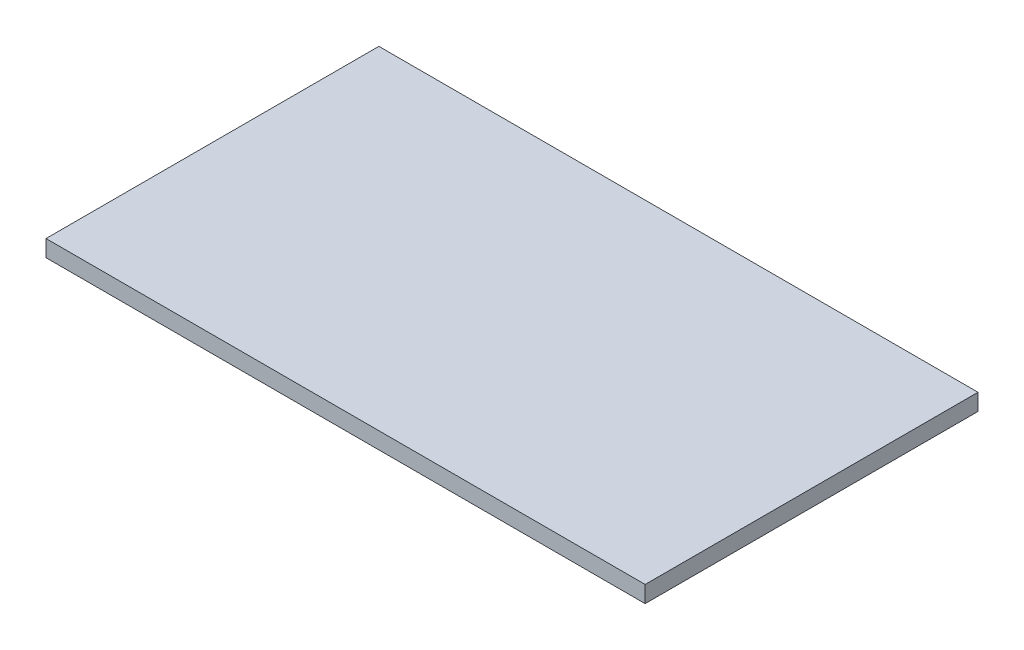
ISO-10303-21;
HEADER;
FILE_DESCRIPTION(('STEP AP214'),'2;1');
FILE_NAME('part.step','',(''),(''),'','','');
FILE_SCHEMA(('AUTOMOTIVE_DESIGN { 1 0 10303 214 1 1 1 1 }'));
ENDSEC;
DATA;
#1=APPLICATION_CONTEXT('core data for automotive mechanical design processes');
#2=APPLICATION_PROTOCOL_DEFINITION('international standard','automotive_design',2000,#1);
#3=PRODUCT_CONTEXT('',#1,'mechanical');
#4=PRODUCT('Part','Part','',(#3));
#5=PRODUCT_RELATED_PRODUCT_CATEGORY('part','',(#4));
#6=PRODUCT_DEFINITION_FORMATION('','',#4);
#7=PRODUCT_DEFINITION_CONTEXT('part definition',#1,'design');
#8=PRODUCT_DEFINITION('design','',#6,#7);
#9=PRODUCT_DEFINITION_SHAPE('','',#8);
#10=(LENGTH_UNIT() NAMED_UNIT(*) SI_UNIT(.MILLI.,.METRE.));
#11=(NAMED_UNIT(*) PLANE_ANGLE_UNIT() SI_UNIT($,.RADIAN.));
#12=(NAMED_UNIT(*) SI_UNIT($,.STERADIAN.) SOLID_ANGLE_UNIT());
#13=UNCERTAINTY_MEASURE_WITH_UNIT(LENGTH_MEASURE(1.E-05),#10,'distance_accuracy_value','');
#14=(GEOMETRIC_REPRESENTATION_CONTEXT(3) GLOBAL_UNCERTAINTY_ASSIGNED_CONTEXT((#13)) GLOBAL_UNIT_ASSIGNED_CONTEXT((#10,
#11,#12)) REPRESENTATION_CONTEXT('',''));
#15=CARTESIAN_POINT('',(0.,0.,0.));
#16=DIRECTION('',(0.,0.,1.));
#17=DIRECTION('',(1.,0.,0.));
#18=AXIS2_PLACEMENT_3D('',#15,#16,#17);
#19=CARTESIAN_POINT('',(0.,5.,0.));
#20=DIRECTION('',(1.,0.,0.));
#21=DIRECTION('',(0.,0.,-1.));
#22=AXIS2_PLACEMENT_3D('',#19,#20,#21);
#23=PLANE('',#22);
#24=DIRECTION('',(0.,0.,1.));
#25=VECTOR('',#24,1.);
#26=CARTESIAN_POINT('',(0.,0.,0.));
#27=LINE('',#26,#25);
#28=CARTESIAN_POINT('',(0.,0.,-100.));
#29=VERTEX_POINT('',#28);
#30=CARTESIAN_POINT('',(0.,0.,0.));
#31=VERTEX_POINT('',#30);
#32=EDGE_CURVE('E98',#29,#31,#27,.T.);
#33=ORIENTED_EDGE('',*,*,#32,.T.);
#34=DIRECTION('',(0.,-1.,0.));
#35=VECTOR('',#34,1.);
#36=CARTESIAN_POINT('',(0.,5.,0.));
#37=LINE('',#36,#35);
#38=CARTESIAN_POINT('',(0.,5.,0.));
#39=VERTEX_POINT('',#38);
#40=EDGE_CURVE('E11',#39,#31,#37,.T.);
#41=ORIENTED_EDGE('',*,*,#40,.F.);
#42=DIRECTION('',(0.,0.,1.));
#43=VECTOR('',#42,1.);
#44=CARTESIAN_POINT('',(0.,5.,0.));
#45=LINE('',#44,#43);
#46=CARTESIAN_POINT('',(0.,5.,-100.));
#47=VERTEX_POINT('',#46);
#48=EDGE_CURVE('E86',#47,#39,#45,.T.);
#49=ORIENTED_EDGE('',*,*,#48,.F.);
#50=DIRECTION('',(0.,-1.,0.));
#51=VECTOR('',#50,1.);
#52=CARTESIAN_POINT('',(0.,5.,-100.));
#53=LINE('',#52,#51);
#54=EDGE_CURVE('E94',#47,#29,#53,.T.);
#55=ORIENTED_EDGE('',*,*,#54,.T.);
#56=EDGE_LOOP('',(#33,#41,#49,#55));
#57=FACE_BOUND('',#56,.T.);
#58=ADVANCED_FACE('F35',(#57),#23,.F.);
#59=CARTESIAN_POINT('',(0.,5.,0.));
#60=DIRECTION('',(0.,0.,-1.));
#61=DIRECTION('',(-1.,0.,0.));
#62=AXIS2_PLACEMENT_3D('',#59,#60,#61);
#63=PLANE('',#62);
#64=DIRECTION('',(1.,0.,0.));
#65=VECTOR('',#64,1.);
#66=CARTESIAN_POINT('',(0.,0.,0.));
#67=LINE('',#66,#65);
#68=CARTESIAN_POINT('',(180.,0.,0.));
#69=VERTEX_POINT('',#68);
#70=EDGE_CURVE('E90',#31,#69,#67,.T.);
#71=ORIENTED_EDGE('',*,*,#70,.T.);
#72=DIRECTION('',(0.,-1.,0.));
#73=VECTOR('',#72,1.);
#74=CARTESIAN_POINT('',(180.,5.,0.));
#75=LINE('',#74,#73);
#76=CARTESIAN_POINT('',(180.,5.,0.));
#77=VERTEX_POINT('',#76);
#78=EDGE_CURVE('E43',#77,#69,#75,.T.);
#79=ORIENTED_EDGE('',*,*,#78,.F.);
#80=DIRECTION('',(1.,0.,0.));
#81=VECTOR('',#80,1.);
#82=CARTESIAN_POINT('',(0.,5.,0.));
#83=LINE('',#82,#81);
#84=EDGE_CURVE('E81',#39,#77,#83,.T.);
#85=ORIENTED_EDGE('',*,*,#84,.F.);
#86=ORIENTED_EDGE('',*,*,#40,.T.);
#87=EDGE_LOOP('',(#71,#79,#85,#86));
#88=FACE_BOUND('',#87,.T.);
#89=ADVANCED_FACE('F89',(#88),#63,.F.);
#90=CARTESIAN_POINT('',(180.,5.,0.));
#91=DIRECTION('',(-1.,0.,0.));
#92=DIRECTION('',(0.,0.,1.));
#93=AXIS2_PLACEMENT_3D('',#90,#91,#92);
#94=PLANE('',#93);
#95=DIRECTION('',(0.,0.,-1.));
#96=VECTOR('',#95,1.);
#97=CARTESIAN_POINT('',(180.,0.,0.));
#98=LINE('',#97,#96);
#99=CARTESIAN_POINT('',(180.,0.,-100.));
#100=VERTEX_POINT('',#99);
#101=EDGE_CURVE('E68',#69,#100,#98,.T.);
#102=ORIENTED_EDGE('',*,*,#101,.T.);
#103=DIRECTION('',(0.,-1.,0.));
#104=VECTOR('',#103,1.);
#105=CARTESIAN_POINT('',(180.,5.,-100.));
#106=LINE('',#105,#104);
#107=CARTESIAN_POINT('',(180.,5.,-100.));
#108=VERTEX_POINT('',#107);
#109=EDGE_CURVE('E91',#108,#100,#106,.T.);
#110=ORIENTED_EDGE('',*,*,#109,.F.);
#111=DIRECTION('',(0.,0.,-1.));
#112=VECTOR('',#111,1.);
#113=CARTESIAN_POINT('',(180.,5.,0.));
#114=LINE('',#113,#112);
#115=EDGE_CURVE('E84',#77,#108,#114,.T.);
#116=ORIENTED_EDGE('',*,*,#115,.F.);
#117=ORIENTED_EDGE('',*,*,#78,.T.);
#118=EDGE_LOOP('',(#102,#110,#116,#117));
#119=FACE_BOUND('',#118,.T.);
#120=ADVANCED_FACE('F92',(#119),#94,.F.);
#121=CARTESIAN_POINT('',(0.,5.,-100.));
#122=DIRECTION('',(0.,0.,1.));
#123=DIRECTION('',(1.,0.,0.));
#124=AXIS2_PLACEMENT_3D('',#121,#122,#123);
#125=PLANE('',#124);
#126=DIRECTION('',(-1.,0.,0.));
#127=VECTOR('',#126,1.);
#128=CARTESIAN_POINT('',(0.,0.,-100.));
#129=LINE('',#128,#127);
#130=EDGE_CURVE('E74',#100,#29,#129,.T.);
#131=ORIENTED_EDGE('',*,*,#130,.T.);
#132=ORIENTED_EDGE('',*,*,#54,.F.);
#133=DIRECTION('',(-1.,0.,0.));
#134=VECTOR('',#133,1.);
#135=CARTESIAN_POINT('',(0.,5.,-100.));
#136=LINE('',#135,#134);
#137=EDGE_CURVE('E51',#108,#47,#136,.T.);
#138=ORIENTED_EDGE('',*,*,#137,.F.);
#139=ORIENTED_EDGE('',*,*,#109,.T.);
#140=EDGE_LOOP('',(#131,#132,#138,#139));
#141=FACE_BOUND('',#140,.T.);
#142=ADVANCED_FACE('F105',(#141),#125,.F.);
#143=CARTESIAN_POINT('',(0.,5.,0.));
#144=DIRECTION('',(0.,-1.,0.));
#145=DIRECTION('',(0.,0.,-1.));
#146=AXIS2_PLACEMENT_3D('',#143,#144,#145);
#147=PLANE('',#146);
#148=ORIENTED_EDGE('',*,*,#48,.T.);
#149=ORIENTED_EDGE('',*,*,#84,.T.);
#150=ORIENTED_EDGE('',*,*,#115,.T.);
#151=ORIENTED_EDGE('',*,*,#137,.T.);
#152=EDGE_LOOP('',(#148,#149,#150,#151));
#153=FACE_BOUND('',#152,.T.);
#154=ADVANCED_FACE('F82',(#153),#147,.F.);
#155=CARTESIAN_POINT('',(0.,0.,0.));
#156=DIRECTION('',(0.,-1.,0.));
#157=DIRECTION('',(0.,0.,-1.));
#158=AXIS2_PLACEMENT_3D('',#155,#156,#157);
#159=PLANE('',#158);
#160=ORIENTED_EDGE('',*,*,#32,.F.);
#161=ORIENTED_EDGE('',*,*,#130,.F.);
#162=ORIENTED_EDGE('',*,*,#101,.F.);
#163=ORIENTED_EDGE('',*,*,#70,.F.);
#164=EDGE_LOOP('',(#160,#161,#162,#163));
#165=FACE_BOUND('',#164,.T.);
#166=ADVANCED_FACE('F108',(#165),#159,.T.);
#167=CLOSED_SHELL('',(#58,#89,#120,#142,#154,#166));
#168=MANIFOLD_SOLID_BREP('B2',#167);
#169=ADVANCED_BREP_SHAPE_REPRESENTATION('',(#18,#168),#14);
#170=SHAPE_DEFINITION_REPRESENTATION(#9,#169);
ENDSEC;
END-ISO-10303-21;
